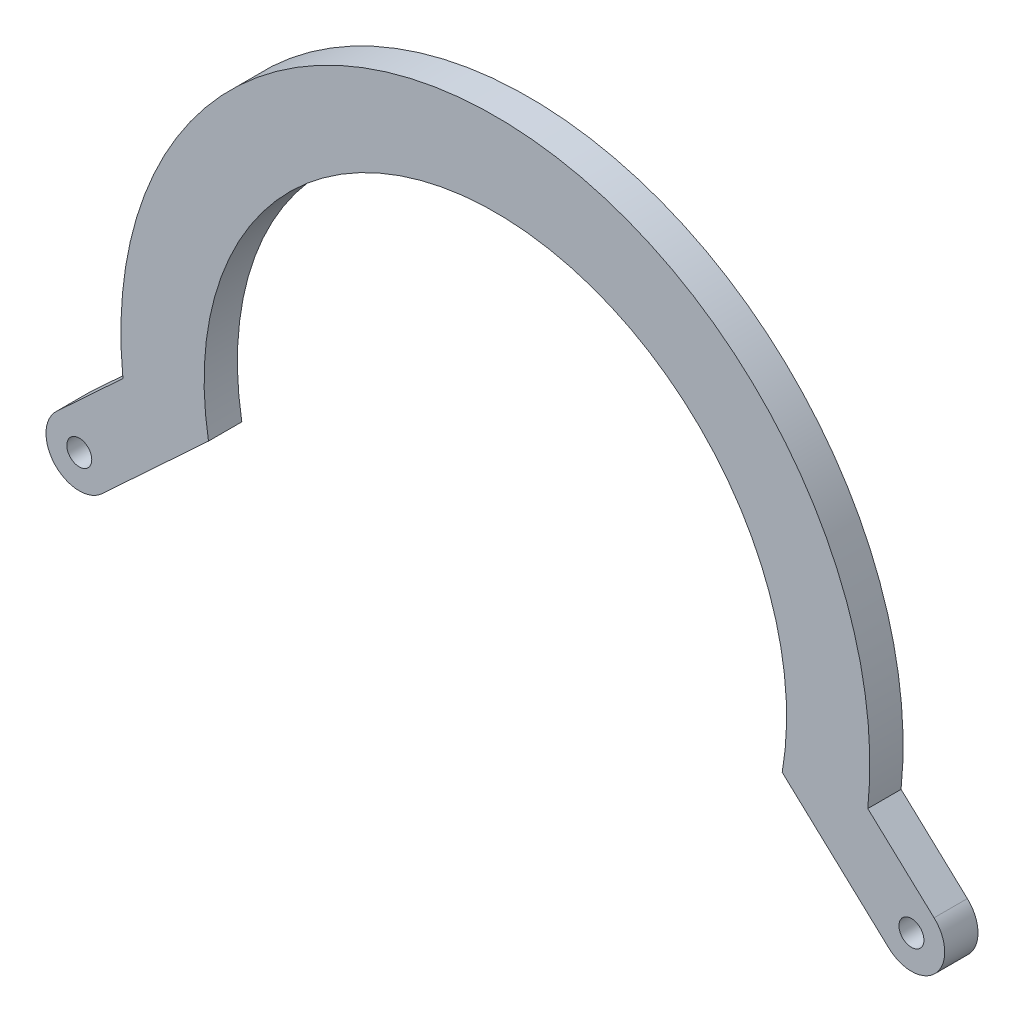
ISO-10303-21;
HEADER;
FILE_DESCRIPTION(('STEP AP214'),'2;1');
FILE_NAME('part.step','',(''),(''),'','','');
FILE_SCHEMA(('AUTOMOTIVE_DESIGN { 1 0 10303 214 1 1 1 1 }'));
ENDSEC;
DATA;
#1=APPLICATION_CONTEXT('core data for automotive mechanical design processes');
#2=APPLICATION_PROTOCOL_DEFINITION('international standard','automotive_design',2000,#1);
#3=PRODUCT_CONTEXT('',#1,'mechanical');
#4=PRODUCT('Part','Part','',(#3));
#5=PRODUCT_RELATED_PRODUCT_CATEGORY('part','',(#4));
#6=PRODUCT_DEFINITION_FORMATION('','',#4);
#7=PRODUCT_DEFINITION_CONTEXT('part definition',#1,'design');
#8=PRODUCT_DEFINITION('design','',#6,#7);
#9=PRODUCT_DEFINITION_SHAPE('','',#8);
#10=(LENGTH_UNIT() NAMED_UNIT(*) SI_UNIT(.MILLI.,.METRE.));
#11=(NAMED_UNIT(*) PLANE_ANGLE_UNIT() SI_UNIT($,.RADIAN.));
#12=(NAMED_UNIT(*) SI_UNIT($,.STERADIAN.) SOLID_ANGLE_UNIT());
#13=UNCERTAINTY_MEASURE_WITH_UNIT(LENGTH_MEASURE(1.E-05),#10,'distance_accuracy_value','');
#14=(GEOMETRIC_REPRESENTATION_CONTEXT(3) GLOBAL_UNCERTAINTY_ASSIGNED_CONTEXT((#13)) GLOBAL_UNIT_ASSIGNED_CONTEXT((#10,
#11,#12)) REPRESENTATION_CONTEXT('',''));
#15=CARTESIAN_POINT('',(0.,0.,0.));
#16=DIRECTION('',(0.,0.,1.));
#17=DIRECTION('',(1.,0.,0.));
#18=AXIS2_PLACEMENT_3D('',#15,#16,#17);
#19=CARTESIAN_POINT('',(0.,0.,4.));
#20=DIRECTION('',(0.,0.,1.));
#21=DIRECTION('',(1.,0.,0.));
#22=AXIS2_PLACEMENT_3D('',#19,#20,#21);
#23=PLANE('',#22);
#24=CARTESIAN_POINT('',(-50.,-15.,4.));
#25=DIRECTION('',(0.,0.,1.));
#26=DIRECTION('',(1.,0.,0.));
#27=AXIS2_PLACEMENT_3D('',#24,#25,#26);
#28=CIRCLE('',#27,1.5);
#29=CARTESIAN_POINT('',(-48.5,-15.,4.));
#30=VERTEX_POINT('',#29);
#31=EDGE_CURVE('E142',#30,#30,#28,.T.);
#32=ORIENTED_EDGE('',*,*,#31,.F.);
#33=EDGE_LOOP('',(#32));
#34=FACE_BOUND('',#33,.T.);
#35=CARTESIAN_POINT('',(0.,0.,4.));
#36=DIRECTION('',(0.,0.,1.));
#37=DIRECTION('',(1.,0.,0.));
#38=AXIS2_PLACEMENT_3D('',#35,#36,#37);
#39=CIRCLE('',#38,45.);
#40=CARTESIAN_POINT('',(44.7557826908382,-4.68187096473918,4.));
#41=VERTEX_POINT('',#40);
#42=CARTESIAN_POINT('',(-44.7557826908382,-4.68187096473917,4.));
#43=VERTEX_POINT('',#42);
#44=EDGE_CURVE('E153',#41,#43,#39,.T.);
#45=ORIENTED_EDGE('',*,*,#44,.T.);
#46=DIRECTION('',(-0.733255346222556,-0.679953378722423,0.));
#47=VECTOR('',#46,1.);
#48=CARTESIAN_POINT('',(-52.7198135148897,-12.0669786151098,4.));
#49=LINE('',#48,#47);
#50=CARTESIAN_POINT('',(-52.7198135148897,-12.0669786151098,4.));
#51=VERTEX_POINT('',#50);
#52=EDGE_CURVE('E101',#43,#51,#49,.T.);
#53=ORIENTED_EDGE('',*,*,#52,.T.);
#54=CARTESIAN_POINT('',(-50.,-15.,4.));
#55=DIRECTION('',(0.,0.,1.));
#56=DIRECTION('',(1.,0.,0.));
#57=AXIS2_PLACEMENT_3D('',#54,#55,#56);
#58=CIRCLE('',#57,4.00000000000002);
#59=CARTESIAN_POINT('',(-47.2801864851103,-17.9330213848902,4.));
#60=VERTEX_POINT('',#59);
#61=EDGE_CURVE('E168',#51,#60,#58,.T.);
#62=ORIENTED_EDGE('',*,*,#61,.T.);
#63=DIRECTION('',(0.733255346222555,0.679953378722424,0.));
#64=VECTOR('',#63,1.);
#65=CARTESIAN_POINT('',(-47.2801864851103,-17.9330213848902,4.));
#66=LINE('',#65,#64);
#67=CARTESIAN_POINT('',(-34.4720923665626,-6.05597621124617,4.));
#68=VERTEX_POINT('',#67);
#69=EDGE_CURVE('E181',#60,#68,#66,.T.);
#70=ORIENTED_EDGE('',*,*,#69,.T.);
#71=CARTESIAN_POINT('',(0.,0.,4.));
#72=DIRECTION('',(0.,0.,-1.));
#73=DIRECTION('',(1.,0.,0.));
#74=AXIS2_PLACEMENT_3D('',#71,#72,#73);
#75=CIRCLE('',#74,35.);
#76=CARTESIAN_POINT('',(34.4720923665626,-6.05597621124615,4.));
#77=VERTEX_POINT('',#76);
#78=EDGE_CURVE('E120',#68,#77,#75,.T.);
#79=ORIENTED_EDGE('',*,*,#78,.T.);
#80=DIRECTION('',(0.733255346222556,-0.679953378722423,0.));
#81=VECTOR('',#80,1.);
#82=CARTESIAN_POINT('',(47.2801864851103,-17.9330213848902,4.));
#83=LINE('',#82,#81);
#84=CARTESIAN_POINT('',(47.2801864851103,-17.9330213848902,4.));
#85=VERTEX_POINT('',#84);
#86=EDGE_CURVE('E114',#77,#85,#83,.T.);
#87=ORIENTED_EDGE('',*,*,#86,.T.);
#88=CARTESIAN_POINT('',(50.,-15.,4.));
#89=DIRECTION('',(0.,0.,1.));
#90=DIRECTION('',(1.,0.,0.));
#91=AXIS2_PLACEMENT_3D('',#88,#89,#90);
#92=CIRCLE('',#91,4.);
#93=CARTESIAN_POINT('',(52.7198135148897,-12.0669786151098,4.));
#94=VERTEX_POINT('',#93);
#95=EDGE_CURVE('E118',#85,#94,#92,.T.);
#96=ORIENTED_EDGE('',*,*,#95,.T.);
#97=DIRECTION('',(-0.733255346222556,0.679953378722423,0.));
#98=VECTOR('',#97,1.);
#99=CARTESIAN_POINT('',(52.7198135148897,-12.0669786151098,4.));
#100=LINE('',#99,#98);
#101=EDGE_CURVE('E58',#94,#41,#100,.T.);
#102=ORIENTED_EDGE('',*,*,#101,.T.);
#103=EDGE_LOOP('',(#45,#53,#62,#70,#79,#87,#96,#102));
#104=FACE_BOUND('',#103,.T.);
#105=CARTESIAN_POINT('',(50.,-15.,4.));
#106=DIRECTION('',(0.,0.,1.));
#107=DIRECTION('',(1.,0.,0.));
#108=AXIS2_PLACEMENT_3D('',#105,#106,#107);
#109=CIRCLE('',#108,1.5);
#110=CARTESIAN_POINT('',(51.5,-15.,4.));
#111=VERTEX_POINT('',#110);
#112=EDGE_CURVE('E190',#111,#111,#109,.T.);
#113=ORIENTED_EDGE('',*,*,#112,.F.);
#114=EDGE_LOOP('',(#113));
#115=FACE_BOUND('',#114,.T.);
#116=ADVANCED_FACE('F41',(#34,#104,#115),#23,.T.);
#117=CARTESIAN_POINT('',(0.,0.,0.));
#118=DIRECTION('',(0.,0.,1.));
#119=DIRECTION('',(1.,0.,0.));
#120=AXIS2_PLACEMENT_3D('',#117,#118,#119);
#121=PLANE('',#120);
#122=CARTESIAN_POINT('',(0.,0.,0.));
#123=DIRECTION('',(0.,0.,1.));
#124=DIRECTION('',(1.,0.,0.));
#125=AXIS2_PLACEMENT_3D('',#122,#123,#124);
#126=CIRCLE('',#125,45.);
#127=CARTESIAN_POINT('',(44.7557826908382,-4.68187096473918,0.));
#128=VERTEX_POINT('',#127);
#129=CARTESIAN_POINT('',(-44.7557826908382,-4.68187096473917,0.));
#130=VERTEX_POINT('',#129);
#131=EDGE_CURVE('E138',#128,#130,#126,.T.);
#132=ORIENTED_EDGE('',*,*,#131,.F.);
#133=DIRECTION('',(-0.733255346222556,0.679953378722423,0.));
#134=VECTOR('',#133,1.);
#135=CARTESIAN_POINT('',(52.7198135148897,-12.0669786151098,0.));
#136=LINE('',#135,#134);
#137=CARTESIAN_POINT('',(52.7198135148897,-12.0669786151098,0.));
#138=VERTEX_POINT('',#137);
#139=EDGE_CURVE('E93',#138,#128,#136,.T.);
#140=ORIENTED_EDGE('',*,*,#139,.F.);
#141=CARTESIAN_POINT('',(50.,-15.,0.));
#142=DIRECTION('',(0.,0.,1.));
#143=DIRECTION('',(1.,0.,0.));
#144=AXIS2_PLACEMENT_3D('',#141,#142,#143);
#145=CIRCLE('',#144,4.);
#146=CARTESIAN_POINT('',(47.2801864851103,-17.9330213848902,0.));
#147=VERTEX_POINT('',#146);
#148=EDGE_CURVE('E87',#147,#138,#145,.T.);
#149=ORIENTED_EDGE('',*,*,#148,.F.);
#150=DIRECTION('',(0.733255346222556,-0.679953378722423,0.));
#151=VECTOR('',#150,1.);
#152=CARTESIAN_POINT('',(47.2801864851103,-17.9330213848902,0.));
#153=LINE('',#152,#151);
#154=CARTESIAN_POINT('',(34.4720923665626,-6.05597621124615,0.));
#155=VERTEX_POINT('',#154);
#156=EDGE_CURVE('E128',#155,#147,#153,.T.);
#157=ORIENTED_EDGE('',*,*,#156,.F.);
#158=CARTESIAN_POINT('',(0.,0.,0.));
#159=DIRECTION('',(0.,0.,-1.));
#160=DIRECTION('',(1.,0.,0.));
#161=AXIS2_PLACEMENT_3D('',#158,#159,#160);
#162=CIRCLE('',#161,35.);
#163=CARTESIAN_POINT('',(-34.4720923665626,-6.05597621124617,0.));
#164=VERTEX_POINT('',#163);
#165=EDGE_CURVE('E148',#164,#155,#162,.T.);
#166=ORIENTED_EDGE('',*,*,#165,.F.);
#167=DIRECTION('',(0.733255346222555,0.679953378722424,0.));
#168=VECTOR('',#167,1.);
#169=CARTESIAN_POINT('',(-47.2801864851103,-17.9330213848902,0.));
#170=LINE('',#169,#168);
#171=CARTESIAN_POINT('',(-47.2801864851103,-17.9330213848902,0.));
#172=VERTEX_POINT('',#171);
#173=EDGE_CURVE('E146',#172,#164,#170,.T.);
#174=ORIENTED_EDGE('',*,*,#173,.F.);
#175=CARTESIAN_POINT('',(-50.,-15.,0.));
#176=DIRECTION('',(0.,0.,1.));
#177=DIRECTION('',(1.,0.,0.));
#178=AXIS2_PLACEMENT_3D('',#175,#176,#177);
#179=CIRCLE('',#178,4.00000000000002);
#180=CARTESIAN_POINT('',(-52.7198135148897,-12.0669786151098,0.));
#181=VERTEX_POINT('',#180);
#182=EDGE_CURVE('E144',#181,#172,#179,.T.);
#183=ORIENTED_EDGE('',*,*,#182,.F.);
#184=DIRECTION('',(-0.733255346222556,-0.679953378722423,0.));
#185=VECTOR('',#184,1.);
#186=CARTESIAN_POINT('',(-52.7198135148897,-12.0669786151098,0.));
#187=LINE('',#186,#185);
#188=EDGE_CURVE('E141',#130,#181,#187,.T.);
#189=ORIENTED_EDGE('',*,*,#188,.F.);
#190=EDGE_LOOP('',(#132,#140,#149,#157,#166,#174,#183,#189));
#191=FACE_BOUND('',#190,.T.);
#192=CARTESIAN_POINT('',(-50.,-15.,0.));
#193=DIRECTION('',(0.,0.,1.));
#194=DIRECTION('',(1.,0.,0.));
#195=AXIS2_PLACEMENT_3D('',#192,#193,#194);
#196=CIRCLE('',#195,1.5);
#197=CARTESIAN_POINT('',(-48.5,-15.,0.));
#198=VERTEX_POINT('',#197);
#199=EDGE_CURVE('E187',#198,#198,#196,.T.);
#200=ORIENTED_EDGE('',*,*,#199,.T.);
#201=EDGE_LOOP('',(#200));
#202=FACE_BOUND('',#201,.T.);
#203=CARTESIAN_POINT('',(50.,-15.,0.));
#204=DIRECTION('',(0.,0.,1.));
#205=DIRECTION('',(1.,0.,0.));
#206=AXIS2_PLACEMENT_3D('',#203,#204,#205);
#207=CIRCLE('',#206,1.5);
#208=CARTESIAN_POINT('',(51.5,-15.,0.));
#209=VERTEX_POINT('',#208);
#210=EDGE_CURVE('E193',#209,#209,#207,.T.);
#211=ORIENTED_EDGE('',*,*,#210,.T.);
#212=EDGE_LOOP('',(#211));
#213=FACE_BOUND('',#212,.T.);
#214=ADVANCED_FACE('F172',(#191,#202,#213),#121,.F.);
#215=CARTESIAN_POINT('',(0.,0.,4.));
#216=DIRECTION('',(0.,0.,-1.));
#217=DIRECTION('',(-1.,0.,0.));
#218=AXIS2_PLACEMENT_3D('',#215,#216,#217);
#219=CYLINDRICAL_SURFACE('',#218,45.);
#220=ORIENTED_EDGE('',*,*,#131,.T.);
#221=DIRECTION('',(0.,0.,-1.));
#222=VECTOR('',#221,1.);
#223=CARTESIAN_POINT('',(-44.7557826908382,-4.68187096473917,4.));
#224=LINE('',#223,#222);
#225=EDGE_CURVE('E11',#43,#130,#224,.T.);
#226=ORIENTED_EDGE('',*,*,#225,.F.);
#227=ORIENTED_EDGE('',*,*,#44,.F.);
#228=DIRECTION('',(0.,0.,-1.));
#229=VECTOR('',#228,1.);
#230=CARTESIAN_POINT('',(44.7557826908382,-4.68187096473918,4.));
#231=LINE('',#230,#229);
#232=EDGE_CURVE('E134',#41,#128,#231,.T.);
#233=ORIENTED_EDGE('',*,*,#232,.T.);
#234=EDGE_LOOP('',(#220,#226,#227,#233));
#235=FACE_BOUND('',#234,.T.);
#236=ADVANCED_FACE('F43',(#235),#219,.T.);
#237=CARTESIAN_POINT('',(-52.7198135148897,-12.0669786151098,4.));
#238=DIRECTION('',(0.679953378722423,-0.733255346222556,0.));
#239=DIRECTION('',(0.733255346222556,0.679953378722423,0.));
#240=AXIS2_PLACEMENT_3D('',#237,#238,#239);
#241=PLANE('',#240);
#242=ORIENTED_EDGE('',*,*,#188,.T.);
#243=DIRECTION('',(0.,0.,-1.));
#244=VECTOR('',#243,1.);
#245=CARTESIAN_POINT('',(-52.7198135148897,-12.0669786151098,4.));
#246=LINE('',#245,#244);
#247=EDGE_CURVE('E50',#51,#181,#246,.T.);
#248=ORIENTED_EDGE('',*,*,#247,.F.);
#249=ORIENTED_EDGE('',*,*,#52,.F.);
#250=ORIENTED_EDGE('',*,*,#225,.T.);
#251=EDGE_LOOP('',(#242,#248,#249,#250));
#252=FACE_BOUND('',#251,.T.);
#253=ADVANCED_FACE('F225',(#252),#241,.F.);
#254=CARTESIAN_POINT('',(-50.,-15.,4.));
#255=DIRECTION('',(0.,0.,-1.));
#256=DIRECTION('',(-1.,0.,0.));
#257=AXIS2_PLACEMENT_3D('',#254,#255,#256);
#258=CYLINDRICAL_SURFACE('',#257,4.00000000000002);
#259=ORIENTED_EDGE('',*,*,#182,.T.);
#260=DIRECTION('',(0.,0.,-1.));
#261=VECTOR('',#260,1.);
#262=CARTESIAN_POINT('',(-47.2801864851103,-17.9330213848902,4.));
#263=LINE('',#262,#261);
#264=EDGE_CURVE('E160',#60,#172,#263,.T.);
#265=ORIENTED_EDGE('',*,*,#264,.F.);
#266=ORIENTED_EDGE('',*,*,#61,.F.);
#267=ORIENTED_EDGE('',*,*,#247,.T.);
#268=EDGE_LOOP('',(#259,#265,#266,#267));
#269=FACE_BOUND('',#268,.T.);
#270=ADVANCED_FACE('F166',(#269),#258,.T.);
#271=CARTESIAN_POINT('',(-47.2801864851103,-17.9330213848902,4.));
#272=DIRECTION('',(-0.679953378722424,0.733255346222555,0.));
#273=DIRECTION('',(-0.733255346222555,-0.679953378722424,0.));
#274=AXIS2_PLACEMENT_3D('',#271,#272,#273);
#275=PLANE('',#274);
#276=ORIENTED_EDGE('',*,*,#173,.T.);
#277=DIRECTION('',(0.,0.,-1.));
#278=VECTOR('',#277,1.);
#279=CARTESIAN_POINT('',(-34.4720923665626,-6.05597621124617,4.));
#280=LINE('',#279,#278);
#281=EDGE_CURVE('E157',#68,#164,#280,.T.);
#282=ORIENTED_EDGE('',*,*,#281,.F.);
#283=ORIENTED_EDGE('',*,*,#69,.F.);
#284=ORIENTED_EDGE('',*,*,#264,.T.);
#285=EDGE_LOOP('',(#276,#282,#283,#284));
#286=FACE_BOUND('',#285,.T.);
#287=ADVANCED_FACE('F177',(#286),#275,.F.);
#288=CARTESIAN_POINT('',(0.,0.,4.));
#289=DIRECTION('',(0.,0.,-1.));
#290=DIRECTION('',(-1.,0.,0.));
#291=AXIS2_PLACEMENT_3D('',#288,#289,#290);
#292=CYLINDRICAL_SURFACE('',#291,35.);
#293=ORIENTED_EDGE('',*,*,#165,.T.);
#294=DIRECTION('',(0.,0.,-1.));
#295=VECTOR('',#294,1.);
#296=CARTESIAN_POINT('',(34.4720923665626,-6.05597621124615,4.));
#297=LINE('',#296,#295);
#298=EDGE_CURVE('E129',#77,#155,#297,.T.);
#299=ORIENTED_EDGE('',*,*,#298,.F.);
#300=ORIENTED_EDGE('',*,*,#78,.F.);
#301=ORIENTED_EDGE('',*,*,#281,.T.);
#302=EDGE_LOOP('',(#293,#299,#300,#301));
#303=FACE_BOUND('',#302,.T.);
#304=ADVANCED_FACE('F180',(#303),#292,.F.);
#305=CARTESIAN_POINT('',(47.2801864851103,-17.9330213848902,4.));
#306=DIRECTION('',(0.679953378722423,0.733255346222556,0.));
#307=DIRECTION('',(-0.733255346222556,0.679953378722423,0.));
#308=AXIS2_PLACEMENT_3D('',#305,#306,#307);
#309=PLANE('',#308);
#310=ORIENTED_EDGE('',*,*,#156,.T.);
#311=DIRECTION('',(0.,0.,-1.));
#312=VECTOR('',#311,1.);
#313=CARTESIAN_POINT('',(47.2801864851103,-17.9330213848902,4.));
#314=LINE('',#313,#312);
#315=EDGE_CURVE('E125',#85,#147,#314,.T.);
#316=ORIENTED_EDGE('',*,*,#315,.F.);
#317=ORIENTED_EDGE('',*,*,#86,.F.);
#318=ORIENTED_EDGE('',*,*,#298,.T.);
#319=EDGE_LOOP('',(#310,#316,#317,#318));
#320=FACE_BOUND('',#319,.T.);
#321=ADVANCED_FACE('F126',(#320),#309,.F.);
#322=CARTESIAN_POINT('',(50.,-15.,4.));
#323=DIRECTION('',(0.,0.,-1.));
#324=DIRECTION('',(-1.,0.,0.));
#325=AXIS2_PLACEMENT_3D('',#322,#323,#324);
#326=CYLINDRICAL_SURFACE('',#325,4.);
#327=ORIENTED_EDGE('',*,*,#148,.T.);
#328=DIRECTION('',(0.,0.,-1.));
#329=VECTOR('',#328,1.);
#330=CARTESIAN_POINT('',(52.7198135148897,-12.0669786151098,4.));
#331=LINE('',#330,#329);
#332=EDGE_CURVE('E130',#94,#138,#331,.T.);
#333=ORIENTED_EDGE('',*,*,#332,.F.);
#334=ORIENTED_EDGE('',*,*,#95,.F.);
#335=ORIENTED_EDGE('',*,*,#315,.T.);
#336=EDGE_LOOP('',(#327,#333,#334,#335));
#337=FACE_BOUND('',#336,.T.);
#338=ADVANCED_FACE('F132',(#337),#326,.T.);
#339=CARTESIAN_POINT('',(52.7198135148897,-12.0669786151098,4.));
#340=DIRECTION('',(-0.679953378722423,-0.733255346222556,0.));
#341=DIRECTION('',(0.733255346222556,-0.679953378722423,0.));
#342=AXIS2_PLACEMENT_3D('',#339,#340,#341);
#343=PLANE('',#342);
#344=ORIENTED_EDGE('',*,*,#139,.T.);
#345=ORIENTED_EDGE('',*,*,#232,.F.);
#346=ORIENTED_EDGE('',*,*,#101,.F.);
#347=ORIENTED_EDGE('',*,*,#332,.T.);
#348=EDGE_LOOP('',(#344,#345,#346,#347));
#349=FACE_BOUND('',#348,.T.);
#350=ADVANCED_FACE('F213',(#349),#343,.F.);
#351=CARTESIAN_POINT('',(-50.,-15.,4.));
#352=DIRECTION('',(0.,0.,-1.));
#353=DIRECTION('',(-1.,0.,0.));
#354=AXIS2_PLACEMENT_3D('',#351,#352,#353);
#355=CYLINDRICAL_SURFACE('',#354,1.5);
#356=ORIENTED_EDGE('',*,*,#31,.T.);
#357=EDGE_LOOP('',(#356));
#358=FACE_BOUND('',#357,.T.);
#359=ORIENTED_EDGE('',*,*,#199,.F.);
#360=EDGE_LOOP('',(#359));
#361=FACE_BOUND('',#360,.T.);
#362=ADVANCED_FACE('F210',(#358,#361),#355,.F.);
#363=CARTESIAN_POINT('',(50.,-15.,4.));
#364=DIRECTION('',(0.,0.,-1.));
#365=DIRECTION('',(-1.,0.,0.));
#366=AXIS2_PLACEMENT_3D('',#363,#364,#365);
#367=CYLINDRICAL_SURFACE('',#366,1.5);
#368=ORIENTED_EDGE('',*,*,#112,.T.);
#369=EDGE_LOOP('',(#368));
#370=FACE_BOUND('',#369,.T.);
#371=ORIENTED_EDGE('',*,*,#210,.F.);
#372=EDGE_LOOP('',(#371));
#373=FACE_BOUND('',#372,.T.);
#374=ADVANCED_FACE('F199',(#370,#373),#367,.F.);
#375=CLOSED_SHELL('',(#116,#214,#236,#253,#270,#287,#304,#321,#338,#350,#362,#374));
#376=MANIFOLD_SOLID_BREP('B2',#375);
#377=ADVANCED_BREP_SHAPE_REPRESENTATION('',(#18,#376),#14);
#378=SHAPE_DEFINITION_REPRESENTATION(#9,#377);
ENDSEC;
END-ISO-10303-21;
